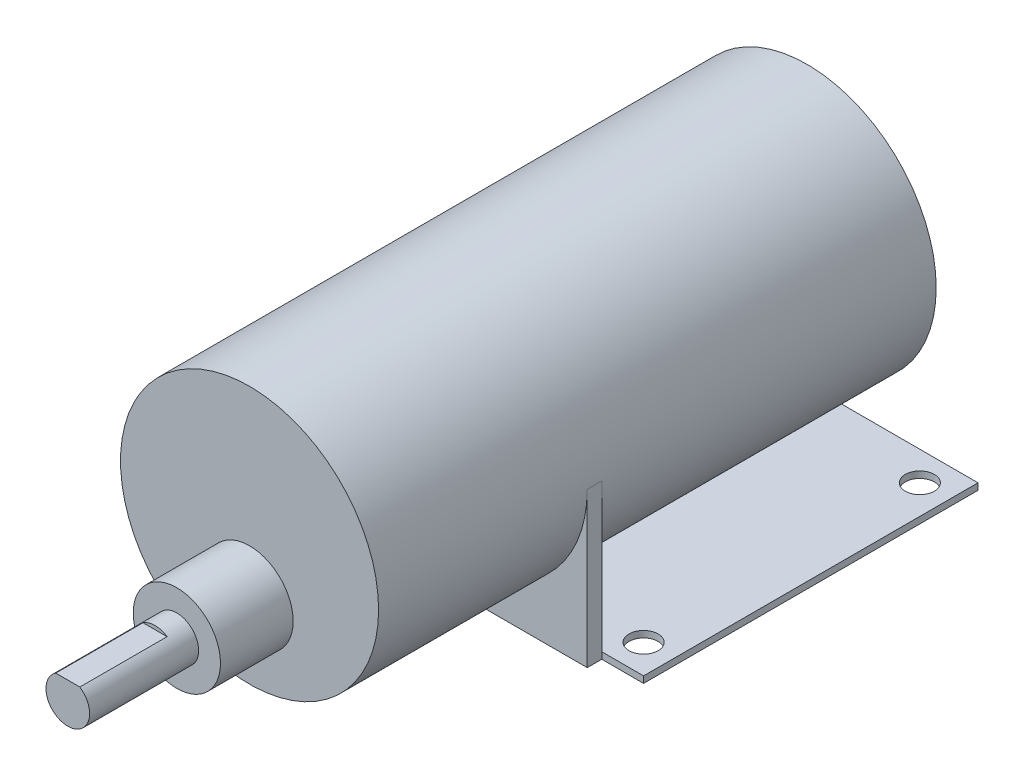
ISO-10303-21;
HEADER;
FILE_DESCRIPTION(('STEP AP214'),'2;1');
FILE_NAME('part.step','',(''),(''),'','','');
FILE_SCHEMA(('AUTOMOTIVE_DESIGN { 1 0 10303 214 1 1 1 1 }'));
ENDSEC;
DATA;
#1=APPLICATION_CONTEXT('core data for automotive mechanical design processes');
#2=APPLICATION_PROTOCOL_DEFINITION('international standard','automotive_design',2000,#1);
#3=PRODUCT_CONTEXT('',#1,'mechanical');
#4=PRODUCT('Part','Part','',(#3));
#5=PRODUCT_RELATED_PRODUCT_CATEGORY('part','',(#4));
#6=PRODUCT_DEFINITION_FORMATION('','',#4);
#7=PRODUCT_DEFINITION_CONTEXT('part definition',#1,'design');
#8=PRODUCT_DEFINITION('design','',#6,#7);
#9=PRODUCT_DEFINITION_SHAPE('','',#8);
#10=(LENGTH_UNIT() NAMED_UNIT(*) SI_UNIT(.MILLI.,.METRE.));
#11=(NAMED_UNIT(*) PLANE_ANGLE_UNIT() SI_UNIT($,.RADIAN.));
#12=(NAMED_UNIT(*) SI_UNIT($,.STERADIAN.) SOLID_ANGLE_UNIT());
#13=UNCERTAINTY_MEASURE_WITH_UNIT(LENGTH_MEASURE(1.E-05),#10,'distance_accuracy_value','');
#14=(GEOMETRIC_REPRESENTATION_CONTEXT(3) GLOBAL_UNCERTAINTY_ASSIGNED_CONTEXT((#13)) GLOBAL_UNIT_ASSIGNED_CONTEXT((#10,
#11,#12)) REPRESENTATION_CONTEXT('',''));
#15=CARTESIAN_POINT('',(0.,0.,0.));
#16=DIRECTION('',(0.,0.,1.));
#17=DIRECTION('',(1.,0.,0.));
#18=AXIS2_PLACEMENT_3D('',#15,#16,#17);
#19=CARTESIAN_POINT('',(0.,0.,46.));
#20=DIRECTION('',(0.,0.,-1.));
#21=DIRECTION('',(-1.,0.,0.));
#22=AXIS2_PLACEMENT_3D('',#19,#20,#21);
#23=PLANE('',#22);
#24=DIRECTION('',(0.,1.,0.));
#25=VECTOR('',#24,1.);
#26=CARTESIAN_POINT('',(17.75,0.,46.));
#27=LINE('',#26,#25);
#28=CARTESIAN_POINT('',(17.75,-20.35,46.));
#29=VERTEX_POINT('',#28);
#30=CARTESIAN_POINT('',(17.75,0.,46.));
#31=VERTEX_POINT('',#30);
#32=EDGE_CURVE('E203',#29,#31,#27,.T.);
#33=ORIENTED_EDGE('',*,*,#32,.F.);
#34=DIRECTION('',(-1.,0.,0.));
#35=VECTOR('',#34,1.);
#36=CARTESIAN_POINT('',(0.,-20.35,46.));
#37=LINE('',#36,#35);
#38=CARTESIAN_POINT('',(-17.75,-20.35,46.));
#39=VERTEX_POINT('',#38);
#40=EDGE_CURVE('E160',#29,#39,#37,.T.);
#41=ORIENTED_EDGE('',*,*,#40,.T.);
#42=DIRECTION('',(0.,-1.,0.));
#43=VECTOR('',#42,1.);
#44=CARTESIAN_POINT('',(-17.75,0.,46.));
#45=LINE('',#44,#43);
#46=CARTESIAN_POINT('',(-17.75,0.,46.));
#47=VERTEX_POINT('',#46);
#48=EDGE_CURVE('E200',#47,#39,#45,.T.);
#49=ORIENTED_EDGE('',*,*,#48,.F.);
#50=CARTESIAN_POINT('',(0.,0.,46.));
#51=DIRECTION('',(0.,0.,1.));
#52=DIRECTION('',(1.,0.,0.));
#53=AXIS2_PLACEMENT_3D('',#50,#51,#52);
#54=CIRCLE('',#53,17.75);
#55=EDGE_CURVE('E218',#47,#31,#54,.T.);
#56=ORIENTED_EDGE('',*,*,#55,.T.);
#57=EDGE_LOOP('',(#33,#41,#49,#56));
#58=FACE_BOUND('',#57,.T.);
#59=ADVANCED_FACE('F40',(#58),#23,.T.);
#60=CARTESIAN_POINT('',(0.,0.,46.));
#61=DIRECTION('',(0.,0.,-1.));
#62=DIRECTION('',(-1.,0.,0.));
#63=AXIS2_PLACEMENT_3D('',#60,#61,#62);
#64=CYLINDRICAL_SURFACE('',#63,17.75);
#65=ORIENTED_EDGE('',*,*,#55,.F.);
#66=DIRECTION('',(0.,0.,-1.));
#67=VECTOR('',#66,1.);
#68=CARTESIAN_POINT('',(-17.75,0.,48.));
#69=LINE('',#68,#67);
#70=CARTESIAN_POINT('',(-17.75,0.,48.));
#71=VERTEX_POINT('',#70);
#72=EDGE_CURVE('E214',#71,#47,#69,.T.);
#73=ORIENTED_EDGE('',*,*,#72,.F.);
#74=CARTESIAN_POINT('',(0.,0.,48.));
#75=DIRECTION('',(0.,0.,1.));
#76=DIRECTION('',(1.,0.,0.));
#77=AXIS2_PLACEMENT_3D('',#74,#75,#76);
#78=CIRCLE('',#77,17.75);
#79=CARTESIAN_POINT('',(17.75,0.,48.));
#80=VERTEX_POINT('',#79);
#81=EDGE_CURVE('E49',#71,#80,#78,.T.);
#82=ORIENTED_EDGE('',*,*,#81,.T.);
#83=DIRECTION('',(0.,0.,-1.));
#84=VECTOR('',#83,1.);
#85=CARTESIAN_POINT('',(17.75,0.,48.));
#86=LINE('',#85,#84);
#87=EDGE_CURVE('E199',#80,#31,#86,.T.);
#88=ORIENTED_EDGE('',*,*,#87,.T.);
#89=EDGE_LOOP('',(#65,#73,#82,#88));
#90=FACE_BOUND('',#89,.T.);
#91=CARTESIAN_POINT('',(0.,0.,0.));
#92=DIRECTION('',(0.,0.,1.));
#93=DIRECTION('',(1.,0.,0.));
#94=AXIS2_PLACEMENT_3D('',#91,#92,#93);
#95=CIRCLE('',#94,17.75);
#96=CARTESIAN_POINT('',(17.75,0.,0.));
#97=VERTEX_POINT('',#96);
#98=EDGE_CURVE('E217',#97,#97,#95,.T.);
#99=ORIENTED_EDGE('',*,*,#98,.T.);
#100=EDGE_LOOP('',(#99));
#101=FACE_BOUND('',#100,.T.);
#102=CARTESIAN_POINT('',(0.,0.,76.7));
#103=DIRECTION('',(0.,0.,1.));
#104=DIRECTION('',(1.,0.,0.));
#105=AXIS2_PLACEMENT_3D('',#102,#103,#104);
#106=CIRCLE('',#105,17.75);
#107=CARTESIAN_POINT('',(17.75,0.,76.7));
#108=VERTEX_POINT('',#107);
#109=EDGE_CURVE('E152',#108,#108,#106,.T.);
#110=ORIENTED_EDGE('',*,*,#109,.F.);
#111=EDGE_LOOP('',(#110));
#112=FACE_BOUND('',#111,.T.);
#113=ADVANCED_FACE('F42',(#90,#101,#112),#64,.T.);
#114=CARTESIAN_POINT('',(0.,0.,0.));
#115=DIRECTION('',(0.,0.,1.));
#116=DIRECTION('',(1.,0.,0.));
#117=AXIS2_PLACEMENT_3D('',#114,#115,#116);
#118=PLANE('',#117);
#119=ORIENTED_EDGE('',*,*,#98,.F.);
#120=EDGE_LOOP('',(#119));
#121=FACE_BOUND('',#120,.T.);
#122=ADVANCED_FACE('F295',(#121),#118,.F.);
#123=CARTESIAN_POINT('',(-17.75,0.,48.));
#124=DIRECTION('',(1.,0.,0.));
#125=DIRECTION('',(0.,1.,0.));
#126=AXIS2_PLACEMENT_3D('',#123,#124,#125);
#127=PLANE('',#126);
#128=ORIENTED_EDGE('',*,*,#48,.T.);
#129=CARTESIAN_POINT('',(-17.75,-21.25,46.));
#130=VERTEX_POINT('',#129);
#131=EDGE_CURVE('E190',#39,#130,#45,.T.);
#132=ORIENTED_EDGE('',*,*,#131,.T.);
#133=DIRECTION('',(0.,0.,-1.));
#134=VECTOR('',#133,1.);
#135=CARTESIAN_POINT('',(-17.75,-21.25,48.));
#136=LINE('',#135,#134);
#137=CARTESIAN_POINT('',(-17.75,-21.25,48.));
#138=VERTEX_POINT('',#137);
#139=EDGE_CURVE('E211',#138,#130,#136,.T.);
#140=ORIENTED_EDGE('',*,*,#139,.F.);
#141=DIRECTION('',(0.,-1.,0.));
#142=VECTOR('',#141,1.);
#143=CARTESIAN_POINT('',(-17.75,0.,48.));
#144=LINE('',#143,#142);
#145=EDGE_CURVE('E191',#71,#138,#144,.T.);
#146=ORIENTED_EDGE('',*,*,#145,.F.);
#147=ORIENTED_EDGE('',*,*,#72,.T.);
#148=EDGE_LOOP('',(#128,#132,#140,#146,#147));
#149=FACE_BOUND('',#148,.T.);
#150=ADVANCED_FACE('F258',(#149),#127,.F.);
#151=CARTESIAN_POINT('',(-17.75,-21.25,48.));
#152=DIRECTION('',(0.,1.,0.));
#153=DIRECTION('',(0.,0.,1.));
#154=AXIS2_PLACEMENT_3D('',#151,#152,#153);
#155=PLANE('',#154);
#156=CARTESIAN_POINT('',(19.5,-21.25,42.));
#157=DIRECTION('',(0.,-1.,0.));
#158=DIRECTION('',(0.,0.,-1.));
#159=AXIS2_PLACEMENT_3D('',#156,#157,#158);
#160=CIRCLE('',#159,2.);
#161=CARTESIAN_POINT('',(19.5,-21.25,40.));
#162=VERTEX_POINT('',#161);
#163=EDGE_CURVE('E241',#162,#162,#160,.T.);
#164=ORIENTED_EDGE('',*,*,#163,.F.);
#165=EDGE_LOOP('',(#164));
#166=FACE_BOUND('',#165,.T.);
#167=CARTESIAN_POINT('',(-19.5,-21.25,4.));
#168=DIRECTION('',(0.,-1.,0.));
#169=DIRECTION('',(0.,0.,-1.));
#170=AXIS2_PLACEMENT_3D('',#167,#168,#169);
#171=CIRCLE('',#170,2.);
#172=CARTESIAN_POINT('',(-19.5,-21.25,2.));
#173=VERTEX_POINT('',#172);
#174=EDGE_CURVE('E242',#173,#173,#171,.T.);
#175=ORIENTED_EDGE('',*,*,#174,.F.);
#176=EDGE_LOOP('',(#175));
#177=FACE_BOUND('',#176,.T.);
#178=CARTESIAN_POINT('',(19.5,-21.25,4.));
#179=DIRECTION('',(0.,-1.,0.));
#180=DIRECTION('',(0.,0.,-1.));
#181=AXIS2_PLACEMENT_3D('',#178,#179,#180);
#182=CIRCLE('',#181,2.);
#183=CARTESIAN_POINT('',(19.5,-21.25,2.));
#184=VERTEX_POINT('',#183);
#185=EDGE_CURVE('E245',#184,#184,#182,.T.);
#186=ORIENTED_EDGE('',*,*,#185,.F.);
#187=EDGE_LOOP('',(#186));
#188=FACE_BOUND('',#187,.T.);
#189=CARTESIAN_POINT('',(-19.5,-21.25,42.));
#190=DIRECTION('',(0.,-1.,0.));
#191=DIRECTION('',(0.,0.,-1.));
#192=AXIS2_PLACEMENT_3D('',#189,#190,#191);
#193=CIRCLE('',#192,2.00000000000001);
#194=CARTESIAN_POINT('',(-19.5,-21.25,40.));
#195=VERTEX_POINT('',#194);
#196=EDGE_CURVE('E229',#195,#195,#193,.T.);
#197=ORIENTED_EDGE('',*,*,#196,.F.);
#198=EDGE_LOOP('',(#197));
#199=FACE_BOUND('',#198,.T.);
#200=ORIENTED_EDGE('',*,*,#139,.T.);
#201=DIRECTION('',(-1.,0.,0.));
#202=VECTOR('',#201,1.);
#203=CARTESIAN_POINT('',(0.,-21.25,46.));
#204=LINE('',#203,#202);
#205=CARTESIAN_POINT('',(-23.5,-21.25,46.));
#206=VERTEX_POINT('',#205);
#207=EDGE_CURVE('E157',#130,#206,#204,.T.);
#208=ORIENTED_EDGE('',*,*,#207,.T.);
#209=DIRECTION('',(0.,0.,1.));
#210=VECTOR('',#209,1.);
#211=CARTESIAN_POINT('',(-23.5,-21.25,0.));
#212=LINE('',#211,#210);
#213=CARTESIAN_POINT('',(-23.5,-21.25,0.));
#214=VERTEX_POINT('',#213);
#215=EDGE_CURVE('E187',#214,#206,#212,.T.);
#216=ORIENTED_EDGE('',*,*,#215,.F.);
#217=DIRECTION('',(-1.,0.,0.));
#218=VECTOR('',#217,1.);
#219=CARTESIAN_POINT('',(0.,-21.25,0.));
#220=LINE('',#219,#218);
#221=CARTESIAN_POINT('',(23.5,-21.25,0.));
#222=VERTEX_POINT('',#221);
#223=EDGE_CURVE('E161',#222,#214,#220,.T.);
#224=ORIENTED_EDGE('',*,*,#223,.F.);
#225=DIRECTION('',(0.,0.,1.));
#226=VECTOR('',#225,1.);
#227=CARTESIAN_POINT('',(23.5,-21.25,0.));
#228=LINE('',#227,#226);
#229=CARTESIAN_POINT('',(23.5,-21.25,46.));
#230=VERTEX_POINT('',#229);
#231=EDGE_CURVE('E170',#222,#230,#228,.T.);
#232=ORIENTED_EDGE('',*,*,#231,.T.);
#233=CARTESIAN_POINT('',(17.75,-21.25,46.));
#234=VERTEX_POINT('',#233);
#235=EDGE_CURVE('E171',#230,#234,#204,.T.);
#236=ORIENTED_EDGE('',*,*,#235,.T.);
#237=DIRECTION('',(0.,0.,-1.));
#238=VECTOR('',#237,1.);
#239=CARTESIAN_POINT('',(17.75,-21.25,48.));
#240=LINE('',#239,#238);
#241=CARTESIAN_POINT('',(17.75,-21.25,48.));
#242=VERTEX_POINT('',#241);
#243=EDGE_CURVE('E208',#242,#234,#240,.T.);
#244=ORIENTED_EDGE('',*,*,#243,.F.);
#245=DIRECTION('',(1.,0.,0.));
#246=VECTOR('',#245,1.);
#247=CARTESIAN_POINT('',(-17.75,-21.25,48.));
#248=LINE('',#247,#246);
#249=EDGE_CURVE('E193',#138,#242,#248,.T.);
#250=ORIENTED_EDGE('',*,*,#249,.F.);
#251=EDGE_LOOP('',(#200,#208,#216,#224,#232,#236,#244,#250));
#252=FACE_BOUND('',#251,.T.);
#253=ADVANCED_FACE('F254',(#166,#177,#188,#199,#252),#155,.F.);
#254=CARTESIAN_POINT('',(17.75,0.,48.));
#255=DIRECTION('',(-1.,0.,0.));
#256=DIRECTION('',(0.,0.,1.));
#257=AXIS2_PLACEMENT_3D('',#254,#255,#256);
#258=PLANE('',#257);
#259=EDGE_CURVE('E194',#234,#29,#27,.T.);
#260=ORIENTED_EDGE('',*,*,#259,.T.);
#261=ORIENTED_EDGE('',*,*,#32,.T.);
#262=ORIENTED_EDGE('',*,*,#87,.F.);
#263=DIRECTION('',(0.,1.,0.));
#264=VECTOR('',#263,1.);
#265=CARTESIAN_POINT('',(17.75,0.,48.));
#266=LINE('',#265,#264);
#267=EDGE_CURVE('E196',#242,#80,#266,.T.);
#268=ORIENTED_EDGE('',*,*,#267,.F.);
#269=ORIENTED_EDGE('',*,*,#243,.T.);
#270=EDGE_LOOP('',(#260,#261,#262,#268,#269));
#271=FACE_BOUND('',#270,.T.);
#272=ADVANCED_FACE('F257',(#271),#258,.F.);
#273=CARTESIAN_POINT('',(0.,0.,48.));
#274=DIRECTION('',(0.,0.,-1.));
#275=DIRECTION('',(-1.,0.,0.));
#276=AXIS2_PLACEMENT_3D('',#273,#274,#275);
#277=PLANE('',#276);
#278=ORIENTED_EDGE('',*,*,#81,.F.);
#279=ORIENTED_EDGE('',*,*,#145,.T.);
#280=ORIENTED_EDGE('',*,*,#249,.T.);
#281=ORIENTED_EDGE('',*,*,#267,.T.);
#282=EDGE_LOOP('',(#278,#279,#280,#281));
#283=FACE_BOUND('',#282,.T.);
#284=ADVANCED_FACE('F291',(#283),#277,.F.);
#285=CARTESIAN_POINT('',(0.,0.,46.));
#286=DIRECTION('',(0.,0.,1.));
#287=DIRECTION('',(1.,0.,0.));
#288=AXIS2_PLACEMENT_3D('',#285,#286,#287);
#289=PLANE('',#288);
#290=ORIENTED_EDGE('',*,*,#131,.F.);
#291=DIRECTION('',(1.,0.,0.));
#292=VECTOR('',#291,1.);
#293=CARTESIAN_POINT('',(23.5,-20.35,46.));
#294=LINE('',#293,#292);
#295=CARTESIAN_POINT('',(-23.5,-20.35,46.));
#296=VERTEX_POINT('',#295);
#297=EDGE_CURVE('E65',#296,#39,#294,.T.);
#298=ORIENTED_EDGE('',*,*,#297,.F.);
#299=DIRECTION('',(0.,1.,0.));
#300=VECTOR('',#299,1.);
#301=CARTESIAN_POINT('',(-23.5,-21.25,46.));
#302=LINE('',#301,#300);
#303=EDGE_CURVE('E174',#206,#296,#302,.T.);
#304=ORIENTED_EDGE('',*,*,#303,.F.);
#305=ORIENTED_EDGE('',*,*,#207,.F.);
#306=EDGE_LOOP('',(#290,#298,#304,#305));
#307=FACE_BOUND('',#306,.T.);
#308=ADVANCED_FACE('F273',(#307),#289,.T.);
#309=ORIENTED_EDGE('',*,*,#259,.F.);
#310=ORIENTED_EDGE('',*,*,#235,.F.);
#311=DIRECTION('',(0.,-1.,0.));
#312=VECTOR('',#311,1.);
#313=CARTESIAN_POINT('',(23.5,-21.25,46.));
#314=LINE('',#313,#312);
#315=CARTESIAN_POINT('',(23.5,-20.35,46.));
#316=VERTEX_POINT('',#315);
#317=EDGE_CURVE('E164',#316,#230,#314,.T.);
#318=ORIENTED_EDGE('',*,*,#317,.F.);
#319=EDGE_CURVE('E176',#29,#316,#294,.T.);
#320=ORIENTED_EDGE('',*,*,#319,.F.);
#321=EDGE_LOOP('',(#309,#310,#318,#320));
#322=FACE_BOUND('',#321,.T.);
#323=ADVANCED_FACE('F286',(#322),#289,.T.);
#324=CARTESIAN_POINT('',(-23.5,-21.25,0.));
#325=DIRECTION('',(1.,0.,0.));
#326=DIRECTION('',(0.,0.,-1.));
#327=AXIS2_PLACEMENT_3D('',#324,#325,#326);
#328=PLANE('',#327);
#329=ORIENTED_EDGE('',*,*,#303,.T.);
#330=DIRECTION('',(0.,0.,1.));
#331=VECTOR('',#330,1.);
#332=CARTESIAN_POINT('',(-23.5,-20.35,0.));
#333=LINE('',#332,#331);
#334=CARTESIAN_POINT('',(-23.5,-20.35,0.));
#335=VERTEX_POINT('',#334);
#336=EDGE_CURVE('E185',#335,#296,#333,.T.);
#337=ORIENTED_EDGE('',*,*,#336,.F.);
#338=DIRECTION('',(0.,1.,0.));
#339=VECTOR('',#338,1.);
#340=CARTESIAN_POINT('',(-23.5,-21.25,0.));
#341=LINE('',#340,#339);
#342=EDGE_CURVE('E163',#214,#335,#341,.T.);
#343=ORIENTED_EDGE('',*,*,#342,.F.);
#344=ORIENTED_EDGE('',*,*,#215,.T.);
#345=EDGE_LOOP('',(#329,#337,#343,#344));
#346=FACE_BOUND('',#345,.T.);
#347=ADVANCED_FACE('F389',(#346),#328,.F.);
#348=CARTESIAN_POINT('',(23.5,-20.35,0.));
#349=DIRECTION('',(0.,-1.,0.));
#350=DIRECTION('',(1.,0.,0.));
#351=AXIS2_PLACEMENT_3D('',#348,#349,#350);
#352=PLANE('',#351);
#353=CARTESIAN_POINT('',(19.5,-20.35,42.));
#354=DIRECTION('',(0.,-1.,0.));
#355=DIRECTION('',(1.,0.,0.));
#356=AXIS2_PLACEMENT_3D('',#353,#354,#355);
#357=CIRCLE('',#356,2.);
#358=CARTESIAN_POINT('',(21.5,-20.35,42.));
#359=VERTEX_POINT('',#358);
#360=EDGE_CURVE('E44',#359,#359,#357,.T.);
#361=ORIENTED_EDGE('',*,*,#360,.T.);
#362=EDGE_LOOP('',(#361));
#363=FACE_BOUND('',#362,.T.);
#364=CARTESIAN_POINT('',(-19.5,-20.35,4.));
#365=DIRECTION('',(0.,-1.,0.));
#366=DIRECTION('',(1.,0.,0.));
#367=AXIS2_PLACEMENT_3D('',#364,#365,#366);
#368=CIRCLE('',#367,2.);
#369=CARTESIAN_POINT('',(-17.5,-20.35,4.));
#370=VERTEX_POINT('',#369);
#371=EDGE_CURVE('E231',#370,#370,#368,.T.);
#372=ORIENTED_EDGE('',*,*,#371,.T.);
#373=EDGE_LOOP('',(#372));
#374=FACE_BOUND('',#373,.T.);
#375=CARTESIAN_POINT('',(19.5,-20.35,4.));
#376=DIRECTION('',(0.,-1.,0.));
#377=DIRECTION('',(1.,0.,0.));
#378=AXIS2_PLACEMENT_3D('',#375,#376,#377);
#379=CIRCLE('',#378,2.);
#380=CARTESIAN_POINT('',(21.5,-20.35,4.));
#381=VERTEX_POINT('',#380);
#382=EDGE_CURVE('E228',#381,#381,#379,.T.);
#383=ORIENTED_EDGE('',*,*,#382,.T.);
#384=EDGE_LOOP('',(#383));
#385=FACE_BOUND('',#384,.T.);
#386=CARTESIAN_POINT('',(-19.5,-20.35,42.));
#387=DIRECTION('',(0.,-1.,0.));
#388=DIRECTION('',(1.,0.,0.));
#389=AXIS2_PLACEMENT_3D('',#386,#387,#388);
#390=CIRCLE('',#389,2.00000000000001);
#391=CARTESIAN_POINT('',(-17.5,-20.35,42.));
#392=VERTEX_POINT('',#391);
#393=EDGE_CURVE('E225',#392,#392,#390,.T.);
#394=ORIENTED_EDGE('',*,*,#393,.T.);
#395=EDGE_LOOP('',(#394));
#396=FACE_BOUND('',#395,.T.);
#397=ORIENTED_EDGE('',*,*,#297,.T.);
#398=ORIENTED_EDGE('',*,*,#40,.F.);
#399=ORIENTED_EDGE('',*,*,#319,.T.);
#400=DIRECTION('',(0.,0.,1.));
#401=VECTOR('',#400,1.);
#402=CARTESIAN_POINT('',(23.5,-20.35,0.));
#403=LINE('',#402,#401);
#404=CARTESIAN_POINT('',(23.5,-20.35,0.));
#405=VERTEX_POINT('',#404);
#406=EDGE_CURVE('E182',#405,#316,#403,.T.);
#407=ORIENTED_EDGE('',*,*,#406,.F.);
#408=DIRECTION('',(1.,0.,0.));
#409=VECTOR('',#408,1.);
#410=CARTESIAN_POINT('',(23.5,-20.35,0.));
#411=LINE('',#410,#409);
#412=EDGE_CURVE('E166',#335,#405,#411,.T.);
#413=ORIENTED_EDGE('',*,*,#412,.F.);
#414=ORIENTED_EDGE('',*,*,#336,.T.);
#415=EDGE_LOOP('',(#397,#398,#399,#407,#413,#414));
#416=FACE_BOUND('',#415,.T.);
#417=ADVANCED_FACE('F277',(#363,#374,#385,#396,#416),#352,.F.);
#418=CARTESIAN_POINT('',(23.5,-21.25,0.));
#419=DIRECTION('',(-1.,0.,0.));
#420=DIRECTION('',(0.,0.,1.));
#421=AXIS2_PLACEMENT_3D('',#418,#419,#420);
#422=PLANE('',#421);
#423=ORIENTED_EDGE('',*,*,#317,.T.);
#424=ORIENTED_EDGE('',*,*,#231,.F.);
#425=DIRECTION('',(0.,-1.,0.));
#426=VECTOR('',#425,1.);
#427=CARTESIAN_POINT('',(23.5,-21.25,0.));
#428=LINE('',#427,#426);
#429=EDGE_CURVE('E168',#405,#222,#428,.T.);
#430=ORIENTED_EDGE('',*,*,#429,.F.);
#431=ORIENTED_EDGE('',*,*,#406,.T.);
#432=EDGE_LOOP('',(#423,#424,#430,#431));
#433=FACE_BOUND('',#432,.T.);
#434=ADVANCED_FACE('F284',(#433),#422,.F.);
#435=CARTESIAN_POINT('',(0.,0.,0.));
#436=DIRECTION('',(0.,0.,1.));
#437=DIRECTION('',(1.,0.,0.));
#438=AXIS2_PLACEMENT_3D('',#435,#436,#437);
#439=PLANE('',#438);
#440=ORIENTED_EDGE('',*,*,#223,.T.);
#441=ORIENTED_EDGE('',*,*,#342,.T.);
#442=ORIENTED_EDGE('',*,*,#412,.T.);
#443=ORIENTED_EDGE('',*,*,#429,.T.);
#444=EDGE_LOOP('',(#440,#441,#442,#443));
#445=FACE_BOUND('',#444,.T.);
#446=ADVANCED_FACE('F303',(#445),#439,.F.);
#447=CARTESIAN_POINT('',(0.,0.,76.7));
#448=DIRECTION('',(0.,0.,1.));
#449=DIRECTION('',(1.,0.,0.));
#450=AXIS2_PLACEMENT_3D('',#447,#448,#449);
#451=PLANE('',#450);
#452=CARTESIAN_POINT('',(0.,-7.25,76.7));
#453=DIRECTION('',(0.,0.,1.));
#454=DIRECTION('',(1.,0.,0.));
#455=AXIS2_PLACEMENT_3D('',#452,#453,#454);
#456=CIRCLE('',#455,6.);
#457=CARTESIAN_POINT('',(6.,-7.25,76.7));
#458=VERTEX_POINT('',#457);
#459=EDGE_CURVE('E147',#458,#458,#456,.T.);
#460=ORIENTED_EDGE('',*,*,#459,.F.);
#461=EDGE_LOOP('',(#460));
#462=FACE_BOUND('',#461,.T.);
#463=ORIENTED_EDGE('',*,*,#109,.T.);
#464=EDGE_LOOP('',(#463));
#465=FACE_BOUND('',#464,.T.);
#466=ADVANCED_FACE('F300',(#462,#465),#451,.T.);
#467=CARTESIAN_POINT('',(0.,-7.25,86.7));
#468=DIRECTION('',(0.,0.,-1.));
#469=DIRECTION('',(-1.,0.,0.));
#470=AXIS2_PLACEMENT_3D('',#467,#468,#469);
#471=CYLINDRICAL_SURFACE('',#470,6.);
#472=CARTESIAN_POINT('',(0.,-7.25,86.7));
#473=DIRECTION('',(0.,0.,1.));
#474=DIRECTION('',(1.,0.,0.));
#475=AXIS2_PLACEMENT_3D('',#472,#473,#474);
#476=CIRCLE('',#475,6.);
#477=CARTESIAN_POINT('',(6.,-7.25,86.7));
#478=VERTEX_POINT('',#477);
#479=EDGE_CURVE('E149',#478,#478,#476,.T.);
#480=ORIENTED_EDGE('',*,*,#479,.F.);
#481=EDGE_LOOP('',(#480));
#482=FACE_BOUND('',#481,.T.);
#483=ORIENTED_EDGE('',*,*,#459,.T.);
#484=EDGE_LOOP('',(#483));
#485=FACE_BOUND('',#484,.T.);
#486=ADVANCED_FACE('F302',(#482,#485),#471,.T.);
#487=CARTESIAN_POINT('',(0.,-7.25,86.7));
#488=DIRECTION('',(0.,0.,1.));
#489=DIRECTION('',(1.,0.,0.));
#490=AXIS2_PLACEMENT_3D('',#487,#488,#489);
#491=PLANE('',#490);
#492=CARTESIAN_POINT('',(0.,-7.25,86.7));
#493=DIRECTION('',(0.,0.,1.));
#494=DIRECTION('',(1.,0.,0.));
#495=AXIS2_PLACEMENT_3D('',#492,#493,#494);
#496=CIRCLE('',#495,3.);
#497=CARTESIAN_POINT('',(3.,-7.25,86.7));
#498=VERTEX_POINT('',#497);
#499=EDGE_CURVE('E11',#498,#498,#496,.T.);
#500=ORIENTED_EDGE('',*,*,#499,.F.);
#501=EDGE_LOOP('',(#500));
#502=FACE_BOUND('',#501,.T.);
#503=ORIENTED_EDGE('',*,*,#479,.T.);
#504=EDGE_LOOP('',(#503));
#505=FACE_BOUND('',#504,.T.);
#506=ADVANCED_FACE('F310',(#502,#505),#491,.T.);
#507=CARTESIAN_POINT('',(0.,-7.25,101.7));
#508=DIRECTION('',(0.,0.,-1.));
#509=DIRECTION('',(-1.,0.,0.));
#510=AXIS2_PLACEMENT_3D('',#507,#508,#509);
#511=CYLINDRICAL_SURFACE('',#510,3.);
#512=CARTESIAN_POINT('',(0.,-7.25,101.7));
#513=DIRECTION('',(0.,0.,1.));
#514=DIRECTION('',(1.,0.,0.));
#515=AXIS2_PLACEMENT_3D('',#512,#513,#514);
#516=CIRCLE('',#515,3.);
#517=CARTESIAN_POINT('',(-1.6583123951777,-4.75,101.7));
#518=VERTEX_POINT('',#517);
#519=CARTESIAN_POINT('',(1.6583123951777,-4.75,101.7));
#520=VERTEX_POINT('',#519);
#521=EDGE_CURVE('E142',#518,#520,#516,.T.);
#522=ORIENTED_EDGE('',*,*,#521,.F.);
#523=DIRECTION('',(0.,0.,1.));
#524=VECTOR('',#523,1.);
#525=CARTESIAN_POINT('',(-1.6583123951777,-4.75,89.7));
#526=LINE('',#525,#524);
#527=CARTESIAN_POINT('',(-1.6583123951777,-4.75,89.7));
#528=VERTEX_POINT('',#527);
#529=EDGE_CURVE('E57',#528,#518,#526,.T.);
#530=ORIENTED_EDGE('',*,*,#529,.F.);
#531=CARTESIAN_POINT('',(0.,-7.25,89.7));
#532=DIRECTION('',(0.,0.,1.));
#533=DIRECTION('',(1.,0.,0.));
#534=AXIS2_PLACEMENT_3D('',#531,#532,#533);
#535=CIRCLE('',#534,3.);
#536=CARTESIAN_POINT('',(1.6583123951777,-4.75,89.7));
#537=VERTEX_POINT('',#536);
#538=EDGE_CURVE('E128',#537,#528,#535,.T.);
#539=ORIENTED_EDGE('',*,*,#538,.F.);
#540=DIRECTION('',(0.,0.,1.));
#541=VECTOR('',#540,1.);
#542=CARTESIAN_POINT('',(1.6583123951777,-4.75,89.7));
#543=LINE('',#542,#541);
#544=EDGE_CURVE('E136',#537,#520,#543,.T.);
#545=ORIENTED_EDGE('',*,*,#544,.T.);
#546=EDGE_LOOP('',(#522,#530,#539,#545));
#547=FACE_BOUND('',#546,.T.);
#548=ORIENTED_EDGE('',*,*,#499,.T.);
#549=EDGE_LOOP('',(#548));
#550=FACE_BOUND('',#549,.T.);
#551=ADVANCED_FACE('F139',(#547,#550),#511,.T.);
#552=CARTESIAN_POINT('',(0.,-7.25,101.7));
#553=DIRECTION('',(0.,0.,1.));
#554=DIRECTION('',(1.,0.,0.));
#555=AXIS2_PLACEMENT_3D('',#552,#553,#554);
#556=PLANE('',#555);
#557=DIRECTION('',(1.,0.,0.));
#558=VECTOR('',#557,1.);
#559=CARTESIAN_POINT('',(-1.6583123951777,-4.75,101.7));
#560=LINE('',#559,#558);
#561=EDGE_CURVE('E133',#518,#520,#560,.T.);
#562=ORIENTED_EDGE('',*,*,#561,.F.);
#563=ORIENTED_EDGE('',*,*,#521,.T.);
#564=EDGE_LOOP('',(#562,#563));
#565=FACE_BOUND('',#564,.T.);
#566=ADVANCED_FACE('F438',(#565),#556,.T.);
#567=CARTESIAN_POINT('',(-1.6583123951777,-4.75,89.7));
#568=DIRECTION('',(0.,-1.,0.));
#569=DIRECTION('',(0.,0.,-1.));
#570=AXIS2_PLACEMENT_3D('',#567,#568,#569);
#571=PLANE('',#570);
#572=ORIENTED_EDGE('',*,*,#561,.T.);
#573=ORIENTED_EDGE('',*,*,#544,.F.);
#574=DIRECTION('',(1.,0.,0.));
#575=VECTOR('',#574,1.);
#576=CARTESIAN_POINT('',(-1.6583123951777,-4.75,89.7));
#577=LINE('',#576,#575);
#578=EDGE_CURVE('E130',#528,#537,#577,.T.);
#579=ORIENTED_EDGE('',*,*,#578,.F.);
#580=ORIENTED_EDGE('',*,*,#529,.T.);
#581=EDGE_LOOP('',(#572,#573,#579,#580));
#582=FACE_BOUND('',#581,.T.);
#583=ADVANCED_FACE('F135',(#582),#571,.F.);
#584=CARTESIAN_POINT('',(0.,-7.25,89.7));
#585=DIRECTION('',(0.,0.,1.));
#586=DIRECTION('',(1.,0.,0.));
#587=AXIS2_PLACEMENT_3D('',#584,#585,#586);
#588=PLANE('',#587);
#589=ORIENTED_EDGE('',*,*,#538,.T.);
#590=ORIENTED_EDGE('',*,*,#578,.T.);
#591=EDGE_LOOP('',(#589,#590));
#592=FACE_BOUND('',#591,.T.);
#593=ADVANCED_FACE('F129',(#592),#588,.T.);
#594=CARTESIAN_POINT('',(-19.5,-9.25,42.));
#595=DIRECTION('',(0.,-1.,0.));
#596=DIRECTION('',(0.,0.,-1.));
#597=AXIS2_PLACEMENT_3D('',#594,#595,#596);
#598=CYLINDRICAL_SURFACE('',#597,2.00000000000001);
#599=ORIENTED_EDGE('',*,*,#196,.T.);
#600=EDGE_LOOP('',(#599));
#601=FACE_BOUND('',#600,.T.);
#602=ORIENTED_EDGE('',*,*,#393,.F.);
#603=EDGE_LOOP('',(#602));
#604=FACE_BOUND('',#603,.T.);
#605=ADVANCED_FACE('F461',(#601,#604),#598,.F.);
#606=CARTESIAN_POINT('',(19.5,-9.25,4.));
#607=DIRECTION('',(0.,-1.,0.));
#608=DIRECTION('',(0.,0.,-1.));
#609=AXIS2_PLACEMENT_3D('',#606,#607,#608);
#610=CYLINDRICAL_SURFACE('',#609,2.);
#611=ORIENTED_EDGE('',*,*,#185,.T.);
#612=EDGE_LOOP('',(#611));
#613=FACE_BOUND('',#612,.T.);
#614=ORIENTED_EDGE('',*,*,#382,.F.);
#615=EDGE_LOOP('',(#614));
#616=FACE_BOUND('',#615,.T.);
#617=ADVANCED_FACE('F251',(#613,#616),#610,.F.);
#618=CARTESIAN_POINT('',(-19.5,-9.25,4.));
#619=DIRECTION('',(0.,-1.,0.));
#620=DIRECTION('',(0.,0.,-1.));
#621=AXIS2_PLACEMENT_3D('',#618,#619,#620);
#622=CYLINDRICAL_SURFACE('',#621,2.);
#623=ORIENTED_EDGE('',*,*,#174,.T.);
#624=EDGE_LOOP('',(#623));
#625=FACE_BOUND('',#624,.T.);
#626=ORIENTED_EDGE('',*,*,#371,.F.);
#627=EDGE_LOOP('',(#626));
#628=FACE_BOUND('',#627,.T.);
#629=ADVANCED_FACE('F477',(#625,#628),#622,.F.);
#630=CARTESIAN_POINT('',(19.5,-9.25,42.));
#631=DIRECTION('',(0.,-1.,0.));
#632=DIRECTION('',(0.,0.,-1.));
#633=AXIS2_PLACEMENT_3D('',#630,#631,#632);
#634=CYLINDRICAL_SURFACE('',#633,2.);
#635=ORIENTED_EDGE('',*,*,#163,.T.);
#636=EDGE_LOOP('',(#635));
#637=FACE_BOUND('',#636,.T.);
#638=ORIENTED_EDGE('',*,*,#360,.F.);
#639=EDGE_LOOP('',(#638));
#640=FACE_BOUND('',#639,.T.);
#641=ADVANCED_FACE('F485',(#637,#640),#634,.F.);
#642=CLOSED_SHELL('',(#59,#113,#122,#150,#253,#272,#284,#308,#323,#347,#417,#434,#446,#466,#486,
#506,#551,#566,#583,#593,#605,#617,#629,#641));
#643=MANIFOLD_SOLID_BREP('B2',#642);
#644=ADVANCED_BREP_SHAPE_REPRESENTATION('',(#18,#643),#14);
#645=SHAPE_DEFINITION_REPRESENTATION(#9,#644);
ENDSEC;
END-ISO-10303-21;
